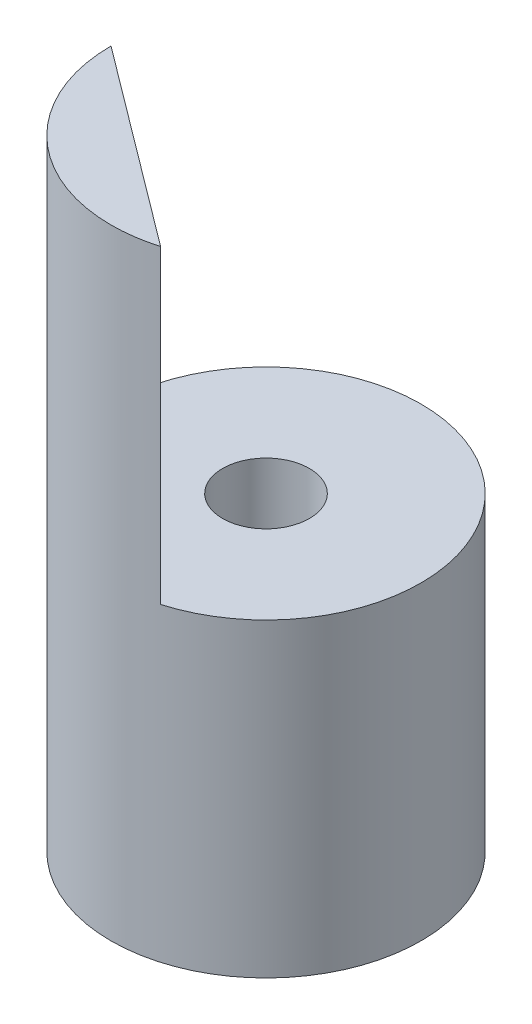
ISO-10303-21;
HEADER;
FILE_DESCRIPTION(('STEP AP214'),'2;1');
FILE_NAME('part.step','',(''),(''),'','','');
FILE_SCHEMA(('AUTOMOTIVE_DESIGN { 1 0 10303 214 1 1 1 1 }'));
ENDSEC;
DATA;
#1=APPLICATION_CONTEXT('core data for automotive mechanical design processes');
#2=APPLICATION_PROTOCOL_DEFINITION('international standard','automotive_design',2000,#1);
#3=PRODUCT_CONTEXT('',#1,'mechanical');
#4=PRODUCT('Part','Part','',(#3));
#5=PRODUCT_RELATED_PRODUCT_CATEGORY('part','',(#4));
#6=PRODUCT_DEFINITION_FORMATION('','',#4);
#7=PRODUCT_DEFINITION_CONTEXT('part definition',#1,'design');
#8=PRODUCT_DEFINITION('design','',#6,#7);
#9=PRODUCT_DEFINITION_SHAPE('','',#8);
#10=(LENGTH_UNIT() NAMED_UNIT(*) SI_UNIT(.MILLI.,.METRE.));
#11=(NAMED_UNIT(*) PLANE_ANGLE_UNIT() SI_UNIT($,.RADIAN.));
#12=(NAMED_UNIT(*) SI_UNIT($,.STERADIAN.) SOLID_ANGLE_UNIT());
#13=UNCERTAINTY_MEASURE_WITH_UNIT(LENGTH_MEASURE(1.E-05),#10,'distance_accuracy_value','');
#14=(GEOMETRIC_REPRESENTATION_CONTEXT(3) GLOBAL_UNCERTAINTY_ASSIGNED_CONTEXT((#13)) GLOBAL_UNIT_ASSIGNED_CONTEXT((#10,
#11,#12)) REPRESENTATION_CONTEXT('',''));
#15=CARTESIAN_POINT('',(0.,0.,0.));
#16=DIRECTION('',(0.,0.,1.));
#17=DIRECTION('',(1.,0.,0.));
#18=AXIS2_PLACEMENT_3D('',#15,#16,#17);
#19=CARTESIAN_POINT('',(0.,-7.5,0.));
#20=DIRECTION('',(0.,1.,0.));
#21=DIRECTION('',(0.,0.,1.));
#22=AXIS2_PLACEMENT_3D('',#19,#20,#21);
#23=CYLINDRICAL_SURFACE('',#22,7.5);
#24=CARTESIAN_POINT('',(0.,-7.5,0.));
#25=DIRECTION('',(0.,1.,0.));
#26=DIRECTION('',(0.,0.,1.));
#27=AXIS2_PLACEMENT_3D('',#24,#25,#26);
#28=CIRCLE('',#27,7.5);
#29=CARTESIAN_POINT('',(0.,-7.5,7.5));
#30=VERTEX_POINT('',#29);
#31=EDGE_CURVE('E11',#30,#30,#28,.T.);
#32=ORIENTED_EDGE('',*,*,#31,.T.);
#33=EDGE_LOOP('',(#32));
#34=FACE_BOUND('',#33,.T.);
#35=CARTESIAN_POINT('',(0.,7.5,0.));
#36=DIRECTION('',(0.,1.,0.));
#37=DIRECTION('',(0.,0.,1.));
#38=AXIS2_PLACEMENT_3D('',#35,#36,#37);
#39=CIRCLE('',#38,7.5);
#40=CARTESIAN_POINT('',(2.1,7.5,7.2));
#41=VERTEX_POINT('',#40);
#42=CARTESIAN_POINT('',(-7.5,7.5,0.));
#43=VERTEX_POINT('',#42);
#44=EDGE_CURVE('E43',#41,#43,#39,.T.);
#45=ORIENTED_EDGE('',*,*,#44,.F.);
#46=DIRECTION('',(0.,-1.,0.));
#47=VECTOR('',#46,1.);
#48=CARTESIAN_POINT('',(2.1,22.5,7.2));
#49=LINE('',#48,#47);
#50=CARTESIAN_POINT('',(2.1,22.5,7.2));
#51=VERTEX_POINT('',#50);
#52=EDGE_CURVE('E67',#51,#41,#49,.T.);
#53=ORIENTED_EDGE('',*,*,#52,.F.);
#54=CARTESIAN_POINT('',(0.,22.5,0.));
#55=DIRECTION('',(0.,1.,0.));
#56=DIRECTION('',(0.,0.,-1.));
#57=AXIS2_PLACEMENT_3D('',#54,#55,#56);
#58=CIRCLE('',#57,7.5);
#59=CARTESIAN_POINT('',(-7.5,22.5,0.));
#60=VERTEX_POINT('',#59);
#61=EDGE_CURVE('E73',#60,#51,#58,.T.);
#62=ORIENTED_EDGE('',*,*,#61,.F.);
#63=DIRECTION('',(0.,-1.,0.));
#64=VECTOR('',#63,1.);
#65=CARTESIAN_POINT('',(-7.5,22.5,0.));
#66=LINE('',#65,#64);
#67=EDGE_CURVE('E71',#60,#43,#66,.T.);
#68=ORIENTED_EDGE('',*,*,#67,.T.);
#69=EDGE_LOOP('',(#45,#53,#62,#68));
#70=FACE_BOUND('',#69,.T.);
#71=ADVANCED_FACE('F35',(#34,#70),#23,.T.);
#72=CARTESIAN_POINT('',(0.,-7.5,0.));
#73=DIRECTION('',(0.,1.,0.));
#74=DIRECTION('',(0.,0.,1.));
#75=AXIS2_PLACEMENT_3D('',#72,#73,#74);
#76=PLANE('',#75);
#77=CARTESIAN_POINT('',(0.,-7.5,0.));
#78=DIRECTION('',(0.,1.,0.));
#79=DIRECTION('',(0.,0.,1.));
#80=AXIS2_PLACEMENT_3D('',#77,#78,#79);
#81=CIRCLE('',#80,2.1);
#82=CARTESIAN_POINT('',(0.,-7.5,2.1));
#83=VERTEX_POINT('',#82);
#84=EDGE_CURVE('E74',#83,#83,#81,.T.);
#85=ORIENTED_EDGE('',*,*,#84,.T.);
#86=EDGE_LOOP('',(#85));
#87=FACE_BOUND('',#86,.T.);
#88=ORIENTED_EDGE('',*,*,#31,.F.);
#89=EDGE_LOOP('',(#88));
#90=FACE_BOUND('',#89,.T.);
#91=ADVANCED_FACE('F92',(#87,#90),#76,.F.);
#92=CARTESIAN_POINT('',(0.,7.5,0.));
#93=DIRECTION('',(0.,1.,0.));
#94=DIRECTION('',(0.,0.,1.));
#95=AXIS2_PLACEMENT_3D('',#92,#93,#94);
#96=PLANE('',#95);
#97=CARTESIAN_POINT('',(0.,7.5,0.));
#98=DIRECTION('',(0.,1.,0.));
#99=DIRECTION('',(0.,0.,1.));
#100=AXIS2_PLACEMENT_3D('',#97,#98,#99);
#101=CIRCLE('',#100,2.1);
#102=CARTESIAN_POINT('',(0.,7.5,2.1));
#103=VERTEX_POINT('',#102);
#104=EDGE_CURVE('E86',#103,#103,#101,.T.);
#105=ORIENTED_EDGE('',*,*,#104,.F.);
#106=EDGE_LOOP('',(#105));
#107=FACE_BOUND('',#106,.T.);
#108=DIRECTION('',(-0.8,0.,-0.6));
#109=VECTOR('',#108,1.);
#110=CARTESIAN_POINT('',(2.1,7.5,7.2));
#111=LINE('',#110,#109);
#112=EDGE_CURVE('E50',#41,#43,#111,.T.);
#113=ORIENTED_EDGE('',*,*,#112,.F.);
#114=ORIENTED_EDGE('',*,*,#44,.T.);
#115=EDGE_LOOP('',(#113,#114));
#116=FACE_BOUND('',#115,.T.);
#117=ADVANCED_FACE('F62',(#107,#116),#96,.T.);
#118=CARTESIAN_POINT('',(2.1,22.5,7.2));
#119=DIRECTION('',(-0.6,0.,0.8));
#120=DIRECTION('',(0.8,0.,0.6));
#121=AXIS2_PLACEMENT_3D('',#118,#119,#120);
#122=PLANE('',#121);
#123=ORIENTED_EDGE('',*,*,#112,.T.);
#124=ORIENTED_EDGE('',*,*,#67,.F.);
#125=DIRECTION('',(-0.8,0.,-0.6));
#126=VECTOR('',#125,1.);
#127=CARTESIAN_POINT('',(2.1,22.5,7.2));
#128=LINE('',#127,#126);
#129=EDGE_CURVE('E58',#51,#60,#128,.T.);
#130=ORIENTED_EDGE('',*,*,#129,.F.);
#131=ORIENTED_EDGE('',*,*,#52,.T.);
#132=EDGE_LOOP('',(#123,#124,#130,#131));
#133=FACE_BOUND('',#132,.T.);
#134=ADVANCED_FACE('F70',(#133),#122,.F.);
#135=CARTESIAN_POINT('',(0.,22.5,0.));
#136=DIRECTION('',(0.,-1.,0.));
#137=DIRECTION('',(0.,0.,-1.));
#138=AXIS2_PLACEMENT_3D('',#135,#136,#137);
#139=PLANE('',#138);
#140=ORIENTED_EDGE('',*,*,#61,.T.);
#141=ORIENTED_EDGE('',*,*,#129,.T.);
#142=EDGE_LOOP('',(#140,#141));
#143=FACE_BOUND('',#142,.T.);
#144=ADVANCED_FACE('F98',(#143),#139,.F.);
#145=CARTESIAN_POINT('',(0.,-7.5,0.));
#146=DIRECTION('',(0.,1.,0.));
#147=DIRECTION('',(0.,0.,1.));
#148=AXIS2_PLACEMENT_3D('',#145,#146,#147);
#149=CYLINDRICAL_SURFACE('',#148,2.1);
#150=ORIENTED_EDGE('',*,*,#84,.F.);
#151=EDGE_LOOP('',(#150));
#152=FACE_BOUND('',#151,.T.);
#153=ORIENTED_EDGE('',*,*,#104,.T.);
#154=EDGE_LOOP('',(#153));
#155=FACE_BOUND('',#154,.T.);
#156=ADVANCED_FACE('F95',(#152,#155),#149,.F.);
#157=CLOSED_SHELL('',(#71,#91,#117,#134,#144,#156));
#158=MANIFOLD_SOLID_BREP('B2',#157);
#159=ADVANCED_BREP_SHAPE_REPRESENTATION('',(#18,#158),#14);
#160=SHAPE_DEFINITION_REPRESENTATION(#9,#159);
ENDSEC;
END-ISO-10303-21;
